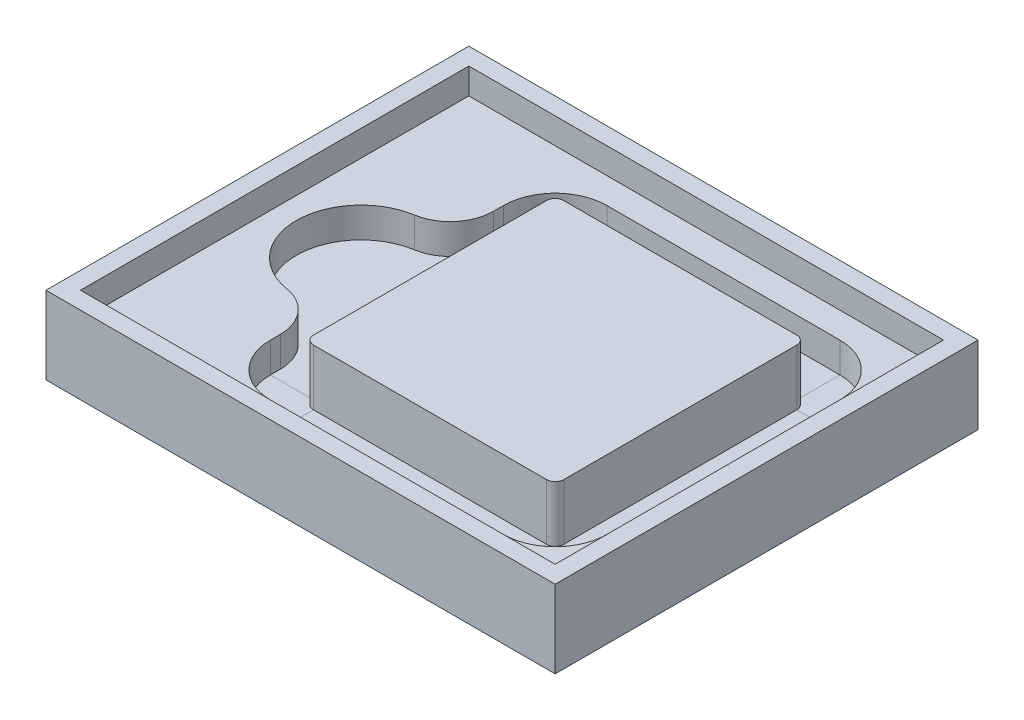
ISO-10303-21;
HEADER;
FILE_DESCRIPTION(('STEP AP214'),'2;1');
FILE_NAME('part.step','',(''),(''),'','','');
FILE_SCHEMA(('AUTOMOTIVE_DESIGN { 1 0 10303 214 1 1 1 1 }'));
ENDSEC;
DATA;
#1=APPLICATION_CONTEXT('core data for automotive mechanical design processes');
#2=APPLICATION_PROTOCOL_DEFINITION('international standard','automotive_design',2000,#1);
#3=PRODUCT_CONTEXT('',#1,'mechanical');
#4=PRODUCT('Part','Part','',(#3));
#5=PRODUCT_RELATED_PRODUCT_CATEGORY('part','',(#4));
#6=PRODUCT_DEFINITION_FORMATION('','',#4);
#7=PRODUCT_DEFINITION_CONTEXT('part definition',#1,'design');
#8=PRODUCT_DEFINITION('design','',#6,#7);
#9=PRODUCT_DEFINITION_SHAPE('','',#8);
#10=(LENGTH_UNIT() NAMED_UNIT(*) SI_UNIT(.MILLI.,.METRE.));
#11=(NAMED_UNIT(*) PLANE_ANGLE_UNIT() SI_UNIT($,.RADIAN.));
#12=(NAMED_UNIT(*) SI_UNIT($,.STERADIAN.) SOLID_ANGLE_UNIT());
#13=UNCERTAINTY_MEASURE_WITH_UNIT(LENGTH_MEASURE(1.E-05),#10,'distance_accuracy_value','');
#14=(GEOMETRIC_REPRESENTATION_CONTEXT(3) GLOBAL_UNCERTAINTY_ASSIGNED_CONTEXT((#13)) GLOBAL_UNIT_ASSIGNED_CONTEXT((#10,
#11,#12)) REPRESENTATION_CONTEXT('',''));
#15=CARTESIAN_POINT('',(0.,0.,0.));
#16=DIRECTION('',(0.,0.,1.));
#17=DIRECTION('',(1.,0.,0.));
#18=AXIS2_PLACEMENT_3D('',#15,#16,#17);
#19=CARTESIAN_POINT('',(0.,9.74999999999999,0.));
#20=DIRECTION('',(0.,-1.,0.));
#21=DIRECTION('',(0.,0.,-1.));
#22=AXIS2_PLACEMENT_3D('',#19,#20,#21);
#23=PLANE('',#22);
#24=DIRECTION('',(0.,0.,-1.));
#25=VECTOR('',#24,1.);
#26=CARTESIAN_POINT('',(6.07343481279655,9.75,-24.3269500399627));
#27=LINE('',#26,#25);
#28=CARTESIAN_POINT('',(6.07343481279655,9.74999999999998,20.6730499600373));
#29=VERTEX_POINT('',#28);
#30=CARTESIAN_POINT('',(6.07343481279655,9.75,-24.3269500399627));
#31=VERTEX_POINT('',#30);
#32=EDGE_CURVE('E524',#29,#31,#27,.T.);
#33=ORIENTED_EDGE('',*,*,#32,.T.);
#34=DIRECTION('',(-1.,0.,0.));
#35=VECTOR('',#34,1.);
#36=CARTESIAN_POINT('',(-48.9265651872034,9.75,-24.3269500399627));
#37=LINE('',#36,#35);
#38=CARTESIAN_POINT('',(-48.9265651872034,9.75,-24.3269500399627));
#39=VERTEX_POINT('',#38);
#40=EDGE_CURVE('E261',#31,#39,#37,.T.);
#41=ORIENTED_EDGE('',*,*,#40,.T.);
#42=DIRECTION('',(0.,0.,1.));
#43=VECTOR('',#42,1.);
#44=CARTESIAN_POINT('',(-48.9265651872034,9.75,-24.3269500399627));
#45=LINE('',#44,#43);
#46=CARTESIAN_POINT('',(-48.9265651872034,9.74999999999998,20.6730499600373));
#47=VERTEX_POINT('',#46);
#48=EDGE_CURVE('E520',#39,#47,#45,.T.);
#49=ORIENTED_EDGE('',*,*,#48,.T.);
#50=DIRECTION('',(1.,0.,0.));
#51=VECTOR('',#50,1.);
#52=CARTESIAN_POINT('',(-48.9265651872034,9.74999999999998,20.6730499600373));
#53=LINE('',#52,#51);
#54=EDGE_CURVE('E56',#47,#29,#53,.T.);
#55=ORIENTED_EDGE('',*,*,#54,.T.);
#56=EDGE_LOOP('',(#33,#41,#49,#55));
#57=FACE_BOUND('',#56,.T.);
#58=DIRECTION('',(-1.,0.,0.));
#59=VECTOR('',#58,1.);
#60=CARTESIAN_POINT('',(-2.92656518720339,9.75,17.6730499600373));
#61=LINE('',#60,#59);
#62=CARTESIAN_POINT('',(-2.92656518720339,9.75,17.6730499600373));
#63=VERTEX_POINT('',#62);
#64=CARTESIAN_POINT('',(-29.9265651872034,9.75,17.6730499600373));
#65=VERTEX_POINT('',#64);
#66=EDGE_CURVE('E407',#63,#65,#61,.T.);
#67=ORIENTED_EDGE('',*,*,#66,.T.);
#68=CARTESIAN_POINT('',(-29.9265651872034,9.75,11.6730499600373));
#69=DIRECTION('',(0.,-1.,0.));
#70=DIRECTION('',(0.,0.,-1.));
#71=AXIS2_PLACEMENT_3D('',#68,#69,#70);
#72=CIRCLE('',#71,5.99999999999998);
#73=CARTESIAN_POINT('',(-35.9265651872034,9.75,11.6730499600374));
#74=VERTEX_POINT('',#73);
#75=EDGE_CURVE('E425',#65,#74,#72,.T.);
#76=ORIENTED_EDGE('',*,*,#75,.T.);
#77=DIRECTION('',(0.,0.,-1.));
#78=VECTOR('',#77,1.);
#79=CARTESIAN_POINT('',(-35.9265651872034,9.75,11.6730499600374));
#80=LINE('',#79,#78);
#81=CARTESIAN_POINT('',(-35.9265651872034,9.75,10.5120126392904));
#82=VERTEX_POINT('',#81);
#83=EDGE_CURVE('E435',#74,#82,#80,.T.);
#84=ORIENTED_EDGE('',*,*,#83,.T.);
#85=CARTESIAN_POINT('',(-40.9265651872034,9.75,10.5120126392904));
#86=DIRECTION('',(0.,-1.,0.));
#87=DIRECTION('',(1.,0.,0.));
#88=AXIS2_PLACEMENT_3D('',#85,#86,#87);
#89=CIRCLE('',#88,5.);
#90=CARTESIAN_POINT('',(-40.1265651872034,9.74999999999999,5.57642756758922));
#91=VERTEX_POINT('',#90);
#92=EDGE_CURVE('E586',#91,#82,#89,.T.);
#93=ORIENTED_EDGE('',*,*,#92,.F.);
#94=CARTESIAN_POINT('',(-38.9265651872034,9.75,-1.82695003996262));
#95=DIRECTION('',(0.,1.,0.));
#96=DIRECTION('',(-1.,0.,0.));
#97=AXIS2_PLACEMENT_3D('',#94,#95,#96);
#98=CIRCLE('',#97,7.5);
#99=CARTESIAN_POINT('',(-40.1265651872034,9.75,-9.23032764751446));
#100=VERTEX_POINT('',#99);
#101=EDGE_CURVE('E64',#100,#91,#98,.T.);
#102=ORIENTED_EDGE('',*,*,#101,.F.);
#103=CARTESIAN_POINT('',(-40.9265651872034,9.75,-14.1659127192157));
#104=DIRECTION('',(0.,-1.,0.));
#105=DIRECTION('',(1.,0.,0.));
#106=AXIS2_PLACEMENT_3D('',#103,#104,#105);
#107=CIRCLE('',#106,5.);
#108=CARTESIAN_POINT('',(-35.9265651872034,9.75,-14.1659127192157));
#109=VERTEX_POINT('',#108);
#110=EDGE_CURVE('E582',#109,#100,#107,.T.);
#111=ORIENTED_EDGE('',*,*,#110,.F.);
#112=DIRECTION('',(0.,0.,1.));
#113=VECTOR('',#112,1.);
#114=CARTESIAN_POINT('',(-35.9265651872034,9.75,-15.3269500399627));
#115=LINE('',#114,#113);
#116=CARTESIAN_POINT('',(-35.9265651872034,9.75,-15.3269500399627));
#117=VERTEX_POINT('',#116);
#118=EDGE_CURVE('E306',#117,#109,#115,.T.);
#119=ORIENTED_EDGE('',*,*,#118,.F.);
#120=CARTESIAN_POINT('',(-29.9265651872034,9.75,-15.3269500399627));
#121=DIRECTION('',(0.,-1.,0.));
#122=DIRECTION('',(0.,0.,-1.));
#123=AXIS2_PLACEMENT_3D('',#120,#121,#122);
#124=CIRCLE('',#123,5.99999999999999);
#125=CARTESIAN_POINT('',(-29.9265651872034,9.75,-21.3269500399627));
#126=VERTEX_POINT('',#125);
#127=EDGE_CURVE('E317',#117,#126,#124,.T.);
#128=ORIENTED_EDGE('',*,*,#127,.T.);
#129=DIRECTION('',(1.,0.,0.));
#130=VECTOR('',#129,1.);
#131=CARTESIAN_POINT('',(-29.9265651872034,9.75,-21.3269500399627));
#132=LINE('',#131,#130);
#133=CARTESIAN_POINT('',(-2.92656518720343,9.75,-21.3269500399627));
#134=VERTEX_POINT('',#133);
#135=EDGE_CURVE('E335',#126,#134,#132,.T.);
#136=ORIENTED_EDGE('',*,*,#135,.T.);
#137=CARTESIAN_POINT('',(-2.92656518720344,9.75,-15.3269500399627));
#138=DIRECTION('',(0.,-1.,0.));
#139=DIRECTION('',(0.,0.,-1.));
#140=AXIS2_PLACEMENT_3D('',#137,#138,#139);
#141=CIRCLE('',#140,5.99999999999999);
#142=CARTESIAN_POINT('',(3.07343481279655,9.75,-15.3269500399627));
#143=VERTEX_POINT('',#142);
#144=EDGE_CURVE('E353',#134,#143,#141,.T.);
#145=ORIENTED_EDGE('',*,*,#144,.T.);
#146=DIRECTION('',(0.,0.,1.));
#147=VECTOR('',#146,1.);
#148=CARTESIAN_POINT('',(3.07343481279655,9.75,-15.3269500399627));
#149=LINE('',#148,#147);
#150=CARTESIAN_POINT('',(3.07343481279655,9.75,11.6730499600374));
#151=VERTEX_POINT('',#150);
#152=EDGE_CURVE('E371',#143,#151,#149,.T.);
#153=ORIENTED_EDGE('',*,*,#152,.T.);
#154=CARTESIAN_POINT('',(-2.92656518720344,9.75,11.6730499600373));
#155=DIRECTION('',(0.,-1.,0.));
#156=DIRECTION('',(0.,0.,-1.));
#157=AXIS2_PLACEMENT_3D('',#154,#155,#156);
#158=CIRCLE('',#157,5.99999999999998);
#159=EDGE_CURVE('E389',#151,#63,#158,.T.);
#160=ORIENTED_EDGE('',*,*,#159,.T.);
#161=EDGE_LOOP('',(#67,#76,#84,#93,#102,#111,#119,#128,#136,#145,#153,#160));
#162=FACE_BOUND('',#161,.T.);
#163=ADVANCED_FACE('F37',(#57,#162),#23,.F.);
#164=CARTESIAN_POINT('',(-30.9265651872034,9.75,11.6730499600373));
#165=DIRECTION('',(1.,0.,0.));
#166=DIRECTION('',(0.,0.,-1.));
#167=AXIS2_PLACEMENT_3D('',#164,#165,#166);
#168=PLANE('',#167);
#169=DIRECTION('',(0.,0.,-1.));
#170=VECTOR('',#169,1.);
#171=CARTESIAN_POINT('',(-30.9265651872034,6.25,11.6730499600373));
#172=LINE('',#171,#170);
#173=CARTESIAN_POINT('',(-30.9265651872034,6.25,11.6730499600373));
#174=VERTEX_POINT('',#173);
#175=CARTESIAN_POINT('',(-30.9265651872034,6.25,-1.82695003996267));
#176=VERTEX_POINT('',#175);
#177=EDGE_CURVE('E448',#174,#176,#172,.T.);
#178=ORIENTED_EDGE('',*,*,#177,.F.);
#179=DIRECTION('',(0.,-1.,0.));
#180=VECTOR('',#179,1.);
#181=CARTESIAN_POINT('',(-30.9265651872034,9.75,11.6730499600373));
#182=LINE('',#181,#180);
#183=CARTESIAN_POINT('',(-30.9265651872034,12.75,11.6730499600374));
#184=VERTEX_POINT('',#183);
#185=EDGE_CURVE('E422',#184,#174,#182,.T.);
#186=ORIENTED_EDGE('',*,*,#185,.F.);
#187=DIRECTION('',(0.,0.,1.));
#188=VECTOR('',#187,1.);
#189=CARTESIAN_POINT('',(-30.9265651872034,12.75,-15.3269500399627));
#190=LINE('',#189,#188);
#191=CARTESIAN_POINT('',(-30.9265651872034,12.75,-15.3269500399627));
#192=VERTEX_POINT('',#191);
#193=EDGE_CURVE('E272',#192,#184,#190,.T.);
#194=ORIENTED_EDGE('',*,*,#193,.F.);
#195=DIRECTION('',(0.,-1.,0.));
#196=VECTOR('',#195,1.);
#197=CARTESIAN_POINT('',(-30.9265651872034,9.75,-15.3269500399627));
#198=LINE('',#197,#196);
#199=CARTESIAN_POINT('',(-30.9265651872034,6.25,-15.3269500399627));
#200=VERTEX_POINT('',#199);
#201=EDGE_CURVE('E296',#192,#200,#198,.T.);
#202=ORIENTED_EDGE('',*,*,#201,.T.);
#203=DIRECTION('',(0.,0.,1.));
#204=VECTOR('',#203,1.);
#205=CARTESIAN_POINT('',(-30.9265651872034,6.25,-15.3269500399627));
#206=LINE('',#205,#204);
#207=EDGE_CURVE('E311',#200,#176,#206,.T.);
#208=ORIENTED_EDGE('',*,*,#207,.T.);
#209=EDGE_LOOP('',(#178,#186,#194,#202,#208));
#210=FACE_BOUND('',#209,.T.);
#211=ADVANCED_FACE('F450',(#210),#168,.F.);
#212=CARTESIAN_POINT('',(-35.9265651872034,9.75,11.6730499600374));
#213=DIRECTION('',(-1.,0.,0.));
#214=DIRECTION('',(0.,0.,1.));
#215=AXIS2_PLACEMENT_3D('',#212,#213,#214);
#216=PLANE('',#215);
#217=ORIENTED_EDGE('',*,*,#83,.F.);
#218=DIRECTION('',(0.,1.,0.));
#219=VECTOR('',#218,1.);
#220=CARTESIAN_POINT('',(-35.9265651872034,9.75,11.6730499600374));
#221=LINE('',#220,#219);
#222=CARTESIAN_POINT('',(-35.9265651872034,6.25,11.6730499600374));
#223=VERTEX_POINT('',#222);
#224=EDGE_CURVE('E416',#223,#74,#221,.T.);
#225=ORIENTED_EDGE('',*,*,#224,.F.);
#226=DIRECTION('',(0.,0.,-1.));
#227=VECTOR('',#226,1.);
#228=CARTESIAN_POINT('',(-35.9265651872034,6.25,11.6730499600374));
#229=LINE('',#228,#227);
#230=CARTESIAN_POINT('',(-35.9265651872034,6.25,10.5120126392904));
#231=VERTEX_POINT('',#230);
#232=EDGE_CURVE('E438',#223,#231,#229,.T.);
#233=ORIENTED_EDGE('',*,*,#232,.T.);
#234=DIRECTION('',(0.,-1.,0.));
#235=VECTOR('',#234,1.);
#236=CARTESIAN_POINT('',(-35.9265651872034,6.25,10.5120126392904));
#237=LINE('',#236,#235);
#238=EDGE_CURVE('E580',#82,#231,#237,.T.);
#239=ORIENTED_EDGE('',*,*,#238,.F.);
#240=EDGE_LOOP('',(#217,#225,#233,#239));
#241=FACE_BOUND('',#240,.T.);
#242=ADVANCED_FACE('F460',(#241),#216,.F.);
#243=CARTESIAN_POINT('',(-29.9265651872034,6.25,11.6730499600373));
#244=DIRECTION('',(0.,-1.,0.));
#245=DIRECTION('',(0.,0.,-1.));
#246=AXIS2_PLACEMENT_3D('',#243,#244,#245);
#247=CYLINDRICAL_SURFACE('',#246,0.999999999999985);
#248=DIRECTION('',(0.,-1.,0.));
#249=VECTOR('',#248,1.);
#250=CARTESIAN_POINT('',(-29.9265651872034,9.75,12.6730499600373));
#251=LINE('',#250,#249);
#252=CARTESIAN_POINT('',(-29.9265651872034,12.75,12.6730499600373));
#253=VERTEX_POINT('',#252);
#254=CARTESIAN_POINT('',(-29.9265651872034,6.25,12.6730499600373));
#255=VERTEX_POINT('',#254);
#256=EDGE_CURVE('E404',#253,#255,#251,.T.);
#257=ORIENTED_EDGE('',*,*,#256,.F.);
#258=CARTESIAN_POINT('',(-29.9265651872034,12.75,11.6730499600373));
#259=DIRECTION('',(0.,1.,0.));
#260=DIRECTION('',(0.,0.,1.));
#261=AXIS2_PLACEMENT_3D('',#258,#259,#260);
#262=CIRCLE('',#261,0.999999999999984);
#263=EDGE_CURVE('E275',#184,#253,#262,.T.);
#264=ORIENTED_EDGE('',*,*,#263,.F.);
#265=ORIENTED_EDGE('',*,*,#185,.T.);
#266=CARTESIAN_POINT('',(-29.9265651872034,6.25,11.6730499600373));
#267=DIRECTION('',(0.,-1.,0.));
#268=DIRECTION('',(0.,0.,-1.));
#269=AXIS2_PLACEMENT_3D('',#266,#267,#268);
#270=CIRCLE('',#269,0.999999999999985);
#271=EDGE_CURVE('E431',#255,#174,#270,.T.);
#272=ORIENTED_EDGE('',*,*,#271,.F.);
#273=EDGE_LOOP('',(#257,#264,#265,#272));
#274=FACE_BOUND('',#273,.T.);
#275=ADVANCED_FACE('F675',(#274),#247,.T.);
#276=CARTESIAN_POINT('',(-29.9265651872034,6.25,12.6730499600373));
#277=DIRECTION('',(0.,-1.,0.));
#278=DIRECTION('',(0.,0.,-1.));
#279=AXIS2_PLACEMENT_3D('',#276,#277,#278);
#280=PLANE('',#279);
#281=DIRECTION('',(0.,0.,1.));
#282=VECTOR('',#281,1.);
#283=CARTESIAN_POINT('',(-29.9265651872034,6.25,12.6730499600373));
#284=LINE('',#283,#282);
#285=CARTESIAN_POINT('',(-29.9265651872034,6.25,17.6730499600373));
#286=VERTEX_POINT('',#285);
#287=EDGE_CURVE('E401',#255,#286,#284,.T.);
#288=ORIENTED_EDGE('',*,*,#287,.F.);
#289=ORIENTED_EDGE('',*,*,#271,.T.);
#290=DIRECTION('',(-1.,0.,0.));
#291=VECTOR('',#290,1.);
#292=CARTESIAN_POINT('',(-30.9265651872034,6.25,11.6730499600373));
#293=LINE('',#292,#291);
#294=EDGE_CURVE('E419',#174,#223,#293,.T.);
#295=ORIENTED_EDGE('',*,*,#294,.T.);
#296=CARTESIAN_POINT('',(-29.9265651872034,6.25,11.6730499600373));
#297=DIRECTION('',(0.,-1.,0.));
#298=DIRECTION('',(0.,0.,-1.));
#299=AXIS2_PLACEMENT_3D('',#296,#297,#298);
#300=CIRCLE('',#299,5.99999999999998);
#301=EDGE_CURVE('E428',#286,#223,#300,.T.);
#302=ORIENTED_EDGE('',*,*,#301,.F.);
#303=EDGE_LOOP('',(#288,#289,#295,#302));
#304=FACE_BOUND('',#303,.T.);
#305=ADVANCED_FACE('F679',(#304),#280,.F.);
#306=CARTESIAN_POINT('',(-29.9265651872034,6.25,11.6730499600373));
#307=DIRECTION('',(0.,-1.,0.));
#308=DIRECTION('',(0.,0.,-1.));
#309=AXIS2_PLACEMENT_3D('',#306,#307,#308);
#310=CYLINDRICAL_SURFACE('',#309,5.99999999999998);
#311=DIRECTION('',(0.,1.,0.));
#312=VECTOR('',#311,1.);
#313=CARTESIAN_POINT('',(-29.9265651872034,9.75,17.6730499600373));
#314=LINE('',#313,#312);
#315=EDGE_CURVE('E398',#286,#65,#314,.T.);
#316=ORIENTED_EDGE('',*,*,#315,.F.);
#317=ORIENTED_EDGE('',*,*,#301,.T.);
#318=ORIENTED_EDGE('',*,*,#224,.T.);
#319=ORIENTED_EDGE('',*,*,#75,.F.);
#320=EDGE_LOOP('',(#316,#317,#318,#319));
#321=FACE_BOUND('',#320,.T.);
#322=ADVANCED_FACE('F634',(#321),#310,.F.);
#323=CARTESIAN_POINT('',(-2.92656518720342,9.75,12.6730499600373));
#324=DIRECTION('',(0.,0.,-1.));
#325=DIRECTION('',(-1.,0.,0.));
#326=AXIS2_PLACEMENT_3D('',#323,#324,#325);
#327=PLANE('',#326);
#328=DIRECTION('',(0.,-1.,0.));
#329=VECTOR('',#328,1.);
#330=CARTESIAN_POINT('',(-2.92656518720342,9.75,12.6730499600373));
#331=LINE('',#330,#329);
#332=CARTESIAN_POINT('',(-2.92656518720342,12.75,12.6730499600373));
#333=VERTEX_POINT('',#332);
#334=CARTESIAN_POINT('',(-2.92656518720342,6.25,12.6730499600373));
#335=VERTEX_POINT('',#334);
#336=EDGE_CURVE('E386',#333,#335,#331,.T.);
#337=ORIENTED_EDGE('',*,*,#336,.F.);
#338=DIRECTION('',(1.,0.,0.));
#339=VECTOR('',#338,1.);
#340=CARTESIAN_POINT('',(-29.9265651872034,12.75,12.6730499600373));
#341=LINE('',#340,#339);
#342=EDGE_CURVE('E278',#253,#333,#341,.T.);
#343=ORIENTED_EDGE('',*,*,#342,.F.);
#344=ORIENTED_EDGE('',*,*,#256,.T.);
#345=DIRECTION('',(-1.,0.,0.));
#346=VECTOR('',#345,1.);
#347=CARTESIAN_POINT('',(-2.92656518720342,6.25,12.6730499600373));
#348=LINE('',#347,#346);
#349=EDGE_CURVE('E413',#335,#255,#348,.T.);
#350=ORIENTED_EDGE('',*,*,#349,.F.);
#351=EDGE_LOOP('',(#337,#343,#344,#350));
#352=FACE_BOUND('',#351,.T.);
#353=ADVANCED_FACE('F677',(#352),#327,.F.);
#354=CARTESIAN_POINT('',(-2.92656518720342,6.25,12.6730499600373));
#355=DIRECTION('',(0.,-1.,0.));
#356=DIRECTION('',(0.,0.,-1.));
#357=AXIS2_PLACEMENT_3D('',#354,#355,#356);
#358=PLANE('',#357);
#359=DIRECTION('',(0.,0.,1.));
#360=VECTOR('',#359,1.);
#361=CARTESIAN_POINT('',(-2.92656518720342,6.25,12.6730499600373));
#362=LINE('',#361,#360);
#363=CARTESIAN_POINT('',(-2.92656518720339,6.25,17.6730499600373));
#364=VERTEX_POINT('',#363);
#365=EDGE_CURVE('E383',#335,#364,#362,.T.);
#366=ORIENTED_EDGE('',*,*,#365,.F.);
#367=ORIENTED_EDGE('',*,*,#349,.T.);
#368=ORIENTED_EDGE('',*,*,#287,.T.);
#369=DIRECTION('',(-1.,0.,0.));
#370=VECTOR('',#369,1.);
#371=CARTESIAN_POINT('',(-2.92656518720339,6.25,17.6730499600373));
#372=LINE('',#371,#370);
#373=EDGE_CURVE('E410',#364,#286,#372,.T.);
#374=ORIENTED_EDGE('',*,*,#373,.F.);
#375=EDGE_LOOP('',(#366,#367,#368,#374));
#376=FACE_BOUND('',#375,.T.);
#377=ADVANCED_FACE('F640',(#376),#358,.F.);
#378=CARTESIAN_POINT('',(-2.92656518720339,9.75,17.6730499600373));
#379=DIRECTION('',(0.,0.,1.));
#380=DIRECTION('',(1.,0.,0.));
#381=AXIS2_PLACEMENT_3D('',#378,#379,#380);
#382=PLANE('',#381);
#383=DIRECTION('',(0.,1.,0.));
#384=VECTOR('',#383,1.);
#385=CARTESIAN_POINT('',(-2.92656518720339,9.75,17.6730499600373));
#386=LINE('',#385,#384);
#387=EDGE_CURVE('E380',#364,#63,#386,.T.);
#388=ORIENTED_EDGE('',*,*,#387,.F.);
#389=ORIENTED_EDGE('',*,*,#373,.T.);
#390=ORIENTED_EDGE('',*,*,#315,.T.);
#391=ORIENTED_EDGE('',*,*,#66,.F.);
#392=EDGE_LOOP('',(#388,#389,#390,#391));
#393=FACE_BOUND('',#392,.T.);
#394=ADVANCED_FACE('F637',(#393),#382,.F.);
#395=CARTESIAN_POINT('',(-2.92656518720344,6.25,11.6730499600373));
#396=DIRECTION('',(0.,-1.,0.));
#397=DIRECTION('',(0.,0.,-1.));
#398=AXIS2_PLACEMENT_3D('',#395,#396,#397);
#399=CYLINDRICAL_SURFACE('',#398,0.999999999999987);
#400=DIRECTION('',(0.,-1.,0.));
#401=VECTOR('',#400,1.);
#402=CARTESIAN_POINT('',(-1.92656518720345,9.75,11.6730499600373));
#403=LINE('',#402,#401);
#404=CARTESIAN_POINT('',(-1.92656518720345,12.75,11.6730499600373));
#405=VERTEX_POINT('',#404);
#406=CARTESIAN_POINT('',(-1.92656518720345,6.25,11.6730499600373));
#407=VERTEX_POINT('',#406);
#408=EDGE_CURVE('E368',#405,#407,#403,.T.);
#409=ORIENTED_EDGE('',*,*,#408,.F.);
#410=CARTESIAN_POINT('',(-2.92656518720344,12.75,11.6730499600373));
#411=DIRECTION('',(0.,1.,0.));
#412=DIRECTION('',(0.,0.,1.));
#413=AXIS2_PLACEMENT_3D('',#410,#411,#412);
#414=CIRCLE('',#413,0.999999999999987);
#415=EDGE_CURVE('E281',#333,#405,#414,.T.);
#416=ORIENTED_EDGE('',*,*,#415,.F.);
#417=ORIENTED_EDGE('',*,*,#336,.T.);
#418=CARTESIAN_POINT('',(-2.92656518720344,6.25,11.6730499600373));
#419=DIRECTION('',(0.,-1.,0.));
#420=DIRECTION('',(0.,0.,-1.));
#421=AXIS2_PLACEMENT_3D('',#418,#419,#420);
#422=CIRCLE('',#421,0.999999999999987);
#423=EDGE_CURVE('E395',#407,#335,#422,.T.);
#424=ORIENTED_EDGE('',*,*,#423,.F.);
#425=EDGE_LOOP('',(#409,#416,#417,#424));
#426=FACE_BOUND('',#425,.T.);
#427=ADVANCED_FACE('F646',(#426),#399,.T.);
#428=CARTESIAN_POINT('',(-1.92656518720345,6.25,11.6730499600373));
#429=DIRECTION('',(0.,-1.,0.));
#430=DIRECTION('',(0.,0.,-1.));
#431=AXIS2_PLACEMENT_3D('',#428,#429,#430);
#432=PLANE('',#431);
#433=DIRECTION('',(1.,0.,0.));
#434=VECTOR('',#433,1.);
#435=CARTESIAN_POINT('',(-1.92656518720345,6.25,11.6730499600373));
#436=LINE('',#435,#434);
#437=CARTESIAN_POINT('',(3.07343481279655,6.25,11.6730499600374));
#438=VERTEX_POINT('',#437);
#439=EDGE_CURVE('E365',#407,#438,#436,.T.);
#440=ORIENTED_EDGE('',*,*,#439,.F.);
#441=ORIENTED_EDGE('',*,*,#423,.T.);
#442=ORIENTED_EDGE('',*,*,#365,.T.);
#443=CARTESIAN_POINT('',(-2.92656518720344,6.25,11.6730499600373));
#444=DIRECTION('',(0.,-1.,0.));
#445=DIRECTION('',(0.,0.,-1.));
#446=AXIS2_PLACEMENT_3D('',#443,#444,#445);
#447=CIRCLE('',#446,5.99999999999998);
#448=EDGE_CURVE('E392',#438,#364,#447,.T.);
#449=ORIENTED_EDGE('',*,*,#448,.F.);
#450=EDGE_LOOP('',(#440,#441,#442,#449));
#451=FACE_BOUND('',#450,.T.);
#452=ADVANCED_FACE('F644',(#451),#432,.F.);
#453=CARTESIAN_POINT('',(-2.92656518720344,6.25,11.6730499600373));
#454=DIRECTION('',(0.,-1.,0.));
#455=DIRECTION('',(0.,0.,-1.));
#456=AXIS2_PLACEMENT_3D('',#453,#454,#455);
#457=CYLINDRICAL_SURFACE('',#456,5.99999999999998);
#458=DIRECTION('',(0.,1.,0.));
#459=VECTOR('',#458,1.);
#460=CARTESIAN_POINT('',(3.07343481279655,9.75,11.6730499600374));
#461=LINE('',#460,#459);
#462=EDGE_CURVE('E362',#438,#151,#461,.T.);
#463=ORIENTED_EDGE('',*,*,#462,.F.);
#464=ORIENTED_EDGE('',*,*,#448,.T.);
#465=ORIENTED_EDGE('',*,*,#387,.T.);
#466=ORIENTED_EDGE('',*,*,#159,.F.);
#467=EDGE_LOOP('',(#463,#464,#465,#466));
#468=FACE_BOUND('',#467,.T.);
#469=ADVANCED_FACE('F698',(#468),#457,.F.);
#470=CARTESIAN_POINT('',(-1.92656518720345,9.75,-15.3269500399627));
#471=DIRECTION('',(-1.,0.,0.));
#472=DIRECTION('',(0.,0.,1.));
#473=AXIS2_PLACEMENT_3D('',#470,#471,#472);
#474=PLANE('',#473);
#475=DIRECTION('',(0.,-1.,0.));
#476=VECTOR('',#475,1.);
#477=CARTESIAN_POINT('',(-1.92656518720345,9.75,-15.3269500399627));
#478=LINE('',#477,#476);
#479=CARTESIAN_POINT('',(-1.92656518720345,12.75,-15.3269500399627));
#480=VERTEX_POINT('',#479);
#481=CARTESIAN_POINT('',(-1.92656518720345,6.25,-15.3269500399627));
#482=VERTEX_POINT('',#481);
#483=EDGE_CURVE('E350',#480,#482,#478,.T.);
#484=ORIENTED_EDGE('',*,*,#483,.F.);
#485=DIRECTION('',(0.,0.,-1.));
#486=VECTOR('',#485,1.);
#487=CARTESIAN_POINT('',(-1.92656518720345,12.75,11.6730499600373));
#488=LINE('',#487,#486);
#489=EDGE_CURVE('E284',#405,#480,#488,.T.);
#490=ORIENTED_EDGE('',*,*,#489,.F.);
#491=ORIENTED_EDGE('',*,*,#408,.T.);
#492=DIRECTION('',(0.,0.,1.));
#493=VECTOR('',#492,1.);
#494=CARTESIAN_POINT('',(-1.92656518720345,6.25,-15.3269500399627));
#495=LINE('',#494,#493);
#496=EDGE_CURVE('E377',#482,#407,#495,.T.);
#497=ORIENTED_EDGE('',*,*,#496,.F.);
#498=EDGE_LOOP('',(#484,#490,#491,#497));
#499=FACE_BOUND('',#498,.T.);
#500=ADVANCED_FACE('F650',(#499),#474,.F.);
#501=CARTESIAN_POINT('',(-1.92656518720345,6.25,-15.3269500399627));
#502=DIRECTION('',(0.,-1.,0.));
#503=DIRECTION('',(1.,0.,0.));
#504=AXIS2_PLACEMENT_3D('',#501,#502,#503);
#505=PLANE('',#504);
#506=DIRECTION('',(1.,0.,0.));
#507=VECTOR('',#506,1.);
#508=CARTESIAN_POINT('',(-1.92656518720345,6.25,-15.3269500399627));
#509=LINE('',#508,#507);
#510=CARTESIAN_POINT('',(3.07343481279655,6.25,-15.3269500399627));
#511=VERTEX_POINT('',#510);
#512=EDGE_CURVE('E347',#482,#511,#509,.T.);
#513=ORIENTED_EDGE('',*,*,#512,.F.);
#514=ORIENTED_EDGE('',*,*,#496,.T.);
#515=ORIENTED_EDGE('',*,*,#439,.T.);
#516=DIRECTION('',(0.,0.,1.));
#517=VECTOR('',#516,1.);
#518=CARTESIAN_POINT('',(3.07343481279655,6.25,-15.3269500399627));
#519=LINE('',#518,#517);
#520=EDGE_CURVE('E374',#511,#438,#519,.T.);
#521=ORIENTED_EDGE('',*,*,#520,.F.);
#522=EDGE_LOOP('',(#513,#514,#515,#521));
#523=FACE_BOUND('',#522,.T.);
#524=ADVANCED_FACE('F704',(#523),#505,.F.);
#525=CARTESIAN_POINT('',(3.07343481279655,9.75,-15.3269500399627));
#526=DIRECTION('',(1.,0.,0.));
#527=DIRECTION('',(0.,0.,-1.));
#528=AXIS2_PLACEMENT_3D('',#525,#526,#527);
#529=PLANE('',#528);
#530=DIRECTION('',(0.,1.,0.));
#531=VECTOR('',#530,1.);
#532=CARTESIAN_POINT('',(3.07343481279655,9.75,-15.3269500399627));
#533=LINE('',#532,#531);
#534=EDGE_CURVE('E344',#511,#143,#533,.T.);
#535=ORIENTED_EDGE('',*,*,#534,.F.);
#536=ORIENTED_EDGE('',*,*,#520,.T.);
#537=ORIENTED_EDGE('',*,*,#462,.T.);
#538=ORIENTED_EDGE('',*,*,#152,.F.);
#539=EDGE_LOOP('',(#535,#536,#537,#538));
#540=FACE_BOUND('',#539,.T.);
#541=ADVANCED_FACE('F707',(#540),#529,.F.);
#542=CARTESIAN_POINT('',(-2.92656518720344,6.25,-15.3269500399627));
#543=DIRECTION('',(0.,-1.,0.));
#544=DIRECTION('',(0.,0.,-1.));
#545=AXIS2_PLACEMENT_3D('',#542,#543,#544);
#546=CYLINDRICAL_SURFACE('',#545,0.99999999999999);
#547=DIRECTION('',(0.,-1.,0.));
#548=VECTOR('',#547,1.);
#549=CARTESIAN_POINT('',(-2.92656518720345,9.75,-16.3269500399627));
#550=LINE('',#549,#548);
#551=CARTESIAN_POINT('',(-2.92656518720345,12.75,-16.3269500399627));
#552=VERTEX_POINT('',#551);
#553=CARTESIAN_POINT('',(-2.92656518720345,6.25,-16.3269500399627));
#554=VERTEX_POINT('',#553);
#555=EDGE_CURVE('E332',#552,#554,#550,.T.);
#556=ORIENTED_EDGE('',*,*,#555,.F.);
#557=CARTESIAN_POINT('',(-2.92656518720344,12.75,-15.3269500399627));
#558=DIRECTION('',(0.,1.,0.));
#559=DIRECTION('',(0.,0.,1.));
#560=AXIS2_PLACEMENT_3D('',#557,#558,#559);
#561=CIRCLE('',#560,0.99999999999999);
#562=EDGE_CURVE('E287',#480,#552,#561,.T.);
#563=ORIENTED_EDGE('',*,*,#562,.F.);
#564=ORIENTED_EDGE('',*,*,#483,.T.);
#565=CARTESIAN_POINT('',(-2.92656518720344,6.25,-15.3269500399627));
#566=DIRECTION('',(0.,-1.,0.));
#567=DIRECTION('',(0.,0.,-1.));
#568=AXIS2_PLACEMENT_3D('',#565,#566,#567);
#569=CIRCLE('',#568,0.99999999999999);
#570=EDGE_CURVE('E359',#554,#482,#569,.T.);
#571=ORIENTED_EDGE('',*,*,#570,.F.);
#572=EDGE_LOOP('',(#556,#563,#564,#571));
#573=FACE_BOUND('',#572,.T.);
#574=ADVANCED_FACE('F654',(#573),#546,.T.);
#575=CARTESIAN_POINT('',(-2.92656518720345,6.25,-16.3269500399627));
#576=DIRECTION('',(0.,-1.,0.));
#577=DIRECTION('',(0.,0.,-1.));
#578=AXIS2_PLACEMENT_3D('',#575,#576,#577);
#579=PLANE('',#578);
#580=DIRECTION('',(0.,0.,-1.));
#581=VECTOR('',#580,1.);
#582=CARTESIAN_POINT('',(-2.92656518720345,6.25,-16.3269500399627));
#583=LINE('',#582,#581);
#584=CARTESIAN_POINT('',(-2.92656518720343,6.25,-21.3269500399627));
#585=VERTEX_POINT('',#584);
#586=EDGE_CURVE('E329',#554,#585,#583,.T.);
#587=ORIENTED_EDGE('',*,*,#586,.F.);
#588=ORIENTED_EDGE('',*,*,#570,.T.);
#589=ORIENTED_EDGE('',*,*,#512,.T.);
#590=CARTESIAN_POINT('',(-2.92656518720344,6.25,-15.3269500399627));
#591=DIRECTION('',(0.,-1.,0.));
#592=DIRECTION('',(0.,0.,-1.));
#593=AXIS2_PLACEMENT_3D('',#590,#591,#592);
#594=CIRCLE('',#593,5.99999999999999);
#595=EDGE_CURVE('E356',#585,#511,#594,.T.);
#596=ORIENTED_EDGE('',*,*,#595,.F.);
#597=EDGE_LOOP('',(#587,#588,#589,#596));
#598=FACE_BOUND('',#597,.T.);
#599=ADVANCED_FACE('F660',(#598),#579,.F.);
#600=CARTESIAN_POINT('',(-2.92656518720344,6.25,-15.3269500399627));
#601=DIRECTION('',(0.,-1.,0.));
#602=DIRECTION('',(0.,0.,-1.));
#603=AXIS2_PLACEMENT_3D('',#600,#601,#602);
#604=CYLINDRICAL_SURFACE('',#603,5.99999999999999);
#605=DIRECTION('',(0.,1.,0.));
#606=VECTOR('',#605,1.);
#607=CARTESIAN_POINT('',(-2.92656518720343,9.75,-21.3269500399627));
#608=LINE('',#607,#606);
#609=EDGE_CURVE('E326',#585,#134,#608,.T.);
#610=ORIENTED_EDGE('',*,*,#609,.F.);
#611=ORIENTED_EDGE('',*,*,#595,.T.);
#612=ORIENTED_EDGE('',*,*,#534,.T.);
#613=ORIENTED_EDGE('',*,*,#144,.F.);
#614=EDGE_LOOP('',(#610,#611,#612,#613));
#615=FACE_BOUND('',#614,.T.);
#616=ADVANCED_FACE('F716',(#615),#604,.F.);
#617=CARTESIAN_POINT('',(-29.9265651872035,9.75,-16.3269500399627));
#618=DIRECTION('',(0.,0.,1.));
#619=DIRECTION('',(1.,0.,0.));
#620=AXIS2_PLACEMENT_3D('',#617,#618,#619);
#621=PLANE('',#620);
#622=DIRECTION('',(0.,-1.,0.));
#623=VECTOR('',#622,1.);
#624=CARTESIAN_POINT('',(-29.9265651872035,9.75,-16.3269500399627));
#625=LINE('',#624,#623);
#626=CARTESIAN_POINT('',(-29.9265651872035,12.75,-16.3269500399627));
#627=VERTEX_POINT('',#626);
#628=CARTESIAN_POINT('',(-29.9265651872035,6.25,-16.3269500399627));
#629=VERTEX_POINT('',#628);
#630=EDGE_CURVE('E314',#627,#629,#625,.T.);
#631=ORIENTED_EDGE('',*,*,#630,.F.);
#632=DIRECTION('',(-1.,0.,0.));
#633=VECTOR('',#632,1.);
#634=CARTESIAN_POINT('',(-2.92656518720345,12.75,-16.3269500399627));
#635=LINE('',#634,#633);
#636=EDGE_CURVE('E290',#552,#627,#635,.T.);
#637=ORIENTED_EDGE('',*,*,#636,.F.);
#638=ORIENTED_EDGE('',*,*,#555,.T.);
#639=DIRECTION('',(1.,0.,0.));
#640=VECTOR('',#639,1.);
#641=CARTESIAN_POINT('',(-29.9265651872035,6.25,-16.3269500399627));
#642=LINE('',#641,#640);
#643=EDGE_CURVE('E341',#629,#554,#642,.T.);
#644=ORIENTED_EDGE('',*,*,#643,.F.);
#645=EDGE_LOOP('',(#631,#637,#638,#644));
#646=FACE_BOUND('',#645,.T.);
#647=ADVANCED_FACE('F658',(#646),#621,.F.);
#648=CARTESIAN_POINT('',(-29.9265651872035,6.25,-16.3269500399627));
#649=DIRECTION('',(0.,-1.,0.));
#650=DIRECTION('',(0.,0.,-1.));
#651=AXIS2_PLACEMENT_3D('',#648,#649,#650);
#652=PLANE('',#651);
#653=DIRECTION('',(0.,0.,-1.));
#654=VECTOR('',#653,1.);
#655=CARTESIAN_POINT('',(-29.9265651872035,6.25,-16.3269500399627));
#656=LINE('',#655,#654);
#657=CARTESIAN_POINT('',(-29.9265651872034,6.25,-21.3269500399627));
#658=VERTEX_POINT('',#657);
#659=EDGE_CURVE('E310',#629,#658,#656,.T.);
#660=ORIENTED_EDGE('',*,*,#659,.F.);
#661=ORIENTED_EDGE('',*,*,#643,.T.);
#662=ORIENTED_EDGE('',*,*,#586,.T.);
#663=DIRECTION('',(1.,0.,0.));
#664=VECTOR('',#663,1.);
#665=CARTESIAN_POINT('',(-29.9265651872034,6.25,-21.3269500399627));
#666=LINE('',#665,#664);
#667=EDGE_CURVE('E338',#658,#585,#666,.T.);
#668=ORIENTED_EDGE('',*,*,#667,.F.);
#669=EDGE_LOOP('',(#660,#661,#662,#668));
#670=FACE_BOUND('',#669,.T.);
#671=ADVANCED_FACE('F664',(#670),#652,.F.);
#672=CARTESIAN_POINT('',(-29.9265651872034,9.75,-21.3269500399627));
#673=DIRECTION('',(0.,0.,-1.));
#674=DIRECTION('',(-1.,0.,0.));
#675=AXIS2_PLACEMENT_3D('',#672,#673,#674);
#676=PLANE('',#675);
#677=DIRECTION('',(0.,1.,0.));
#678=VECTOR('',#677,1.);
#679=CARTESIAN_POINT('',(-29.9265651872034,9.75,-21.3269500399627));
#680=LINE('',#679,#678);
#681=EDGE_CURVE('E307',#658,#126,#680,.T.);
#682=ORIENTED_EDGE('',*,*,#681,.F.);
#683=ORIENTED_EDGE('',*,*,#667,.T.);
#684=ORIENTED_EDGE('',*,*,#609,.T.);
#685=ORIENTED_EDGE('',*,*,#135,.F.);
#686=EDGE_LOOP('',(#682,#683,#684,#685));
#687=FACE_BOUND('',#686,.T.);
#688=ADVANCED_FACE('F724',(#687),#676,.F.);
#689=CARTESIAN_POINT('',(-29.9265651872034,6.25,-15.3269500399627));
#690=DIRECTION('',(0.,-1.,0.));
#691=DIRECTION('',(0.,0.,-1.));
#692=AXIS2_PLACEMENT_3D('',#689,#690,#691);
#693=CYLINDRICAL_SURFACE('',#692,0.99999999999999);
#694=ORIENTED_EDGE('',*,*,#201,.F.);
#695=CARTESIAN_POINT('',(-29.9265651872034,12.75,-15.3269500399627));
#696=DIRECTION('',(0.,1.,0.));
#697=DIRECTION('',(0.,0.,1.));
#698=AXIS2_PLACEMENT_3D('',#695,#696,#697);
#699=CIRCLE('',#698,0.99999999999999);
#700=EDGE_CURVE('E247',#627,#192,#699,.T.);
#701=ORIENTED_EDGE('',*,*,#700,.F.);
#702=ORIENTED_EDGE('',*,*,#630,.T.);
#703=CARTESIAN_POINT('',(-29.9265651872034,6.25,-15.3269500399627));
#704=DIRECTION('',(0.,-1.,0.));
#705=DIRECTION('',(0.,0.,-1.));
#706=AXIS2_PLACEMENT_3D('',#703,#704,#705);
#707=CIRCLE('',#706,0.99999999999999);
#708=EDGE_CURVE('E323',#200,#629,#707,.T.);
#709=ORIENTED_EDGE('',*,*,#708,.F.);
#710=EDGE_LOOP('',(#694,#701,#702,#709));
#711=FACE_BOUND('',#710,.T.);
#712=ADVANCED_FACE('F669',(#711),#693,.T.);
#713=CARTESIAN_POINT('',(-30.9265651872034,6.25,-15.3269500399627));
#714=DIRECTION('',(0.,-1.,0.));
#715=DIRECTION('',(0.,0.,-1.));
#716=AXIS2_PLACEMENT_3D('',#713,#714,#715);
#717=PLANE('',#716);
#718=DIRECTION('',(-1.,0.,0.));
#719=VECTOR('',#718,1.);
#720=CARTESIAN_POINT('',(-30.9265651872034,6.25,-15.3269500399627));
#721=LINE('',#720,#719);
#722=CARTESIAN_POINT('',(-35.9265651872034,6.25,-15.3269500399627));
#723=VERTEX_POINT('',#722);
#724=EDGE_CURVE('E300',#200,#723,#721,.T.);
#725=ORIENTED_EDGE('',*,*,#724,.F.);
#726=ORIENTED_EDGE('',*,*,#708,.T.);
#727=ORIENTED_EDGE('',*,*,#659,.T.);
#728=CARTESIAN_POINT('',(-29.9265651872034,6.25,-15.3269500399627));
#729=DIRECTION('',(0.,-1.,0.));
#730=DIRECTION('',(0.,0.,-1.));
#731=AXIS2_PLACEMENT_3D('',#728,#729,#730);
#732=CIRCLE('',#731,5.99999999999999);
#733=EDGE_CURVE('E320',#723,#658,#732,.T.);
#734=ORIENTED_EDGE('',*,*,#733,.F.);
#735=EDGE_LOOP('',(#725,#726,#727,#734));
#736=FACE_BOUND('',#735,.T.);
#737=ADVANCED_FACE('F667',(#736),#717,.F.);
#738=CARTESIAN_POINT('',(-29.9265651872034,6.25,-15.3269500399627));
#739=DIRECTION('',(0.,-1.,0.));
#740=DIRECTION('',(0.,0.,-1.));
#741=AXIS2_PLACEMENT_3D('',#738,#739,#740);
#742=CYLINDRICAL_SURFACE('',#741,5.99999999999999);
#743=DIRECTION('',(0.,1.,0.));
#744=VECTOR('',#743,1.);
#745=CARTESIAN_POINT('',(-35.9265651872034,9.75,-15.3269500399627));
#746=LINE('',#745,#744);
#747=EDGE_CURVE('E303',#723,#117,#746,.T.);
#748=ORIENTED_EDGE('',*,*,#747,.F.);
#749=ORIENTED_EDGE('',*,*,#733,.T.);
#750=ORIENTED_EDGE('',*,*,#681,.T.);
#751=ORIENTED_EDGE('',*,*,#127,.F.);
#752=EDGE_LOOP('',(#748,#749,#750,#751));
#753=FACE_BOUND('',#752,.T.);
#754=ADVANCED_FACE('F554',(#753),#742,.F.);
#755=CARTESIAN_POINT('',(-30.9265651872034,6.25,-15.3269500399627));
#756=DIRECTION('',(0.,1.,0.));
#757=DIRECTION('',(-1.,0.,0.));
#758=AXIS2_PLACEMENT_3D('',#755,#756,#757);
#759=PLANE('',#758);
#760=ORIENTED_EDGE('',*,*,#207,.F.);
#761=ORIENTED_EDGE('',*,*,#724,.T.);
#762=DIRECTION('',(0.,0.,1.));
#763=VECTOR('',#762,1.);
#764=CARTESIAN_POINT('',(-35.9265651872034,6.25,-15.3269500399627));
#765=LINE('',#764,#763);
#766=CARTESIAN_POINT('',(-35.9265651872034,6.25,-14.1659127192157));
#767=VERTEX_POINT('',#766);
#768=EDGE_CURVE('E616',#723,#767,#765,.T.);
#769=ORIENTED_EDGE('',*,*,#768,.T.);
#770=CARTESIAN_POINT('',(-40.9265651872034,6.25,-14.1659127192157));
#771=DIRECTION('',(0.,1.,0.));
#772=DIRECTION('',(-1.,0.,0.));
#773=AXIS2_PLACEMENT_3D('',#770,#771,#772);
#774=CIRCLE('',#773,5.);
#775=CARTESIAN_POINT('',(-40.1265651872034,6.25,-9.23032764751446));
#776=VERTEX_POINT('',#775);
#777=EDGE_CURVE('E584',#776,#767,#774,.T.);
#778=ORIENTED_EDGE('',*,*,#777,.F.);
#779=CARTESIAN_POINT('',(-38.9265651872034,6.25,-1.82695003996262));
#780=DIRECTION('',(0.,1.,0.));
#781=DIRECTION('',(-1.,0.,0.));
#782=AXIS2_PLACEMENT_3D('',#779,#780,#781);
#783=CIRCLE('',#782,7.5);
#784=CARTESIAN_POINT('',(-40.1265651872034,6.25,5.57642756758922));
#785=VERTEX_POINT('',#784);
#786=EDGE_CURVE('E293',#785,#776,#783,.F.);
#787=ORIENTED_EDGE('',*,*,#786,.F.);
#788=CARTESIAN_POINT('',(-40.9265651872034,6.25,10.5120126392904));
#789=DIRECTION('',(0.,1.,0.));
#790=DIRECTION('',(-1.,0.,0.));
#791=AXIS2_PLACEMENT_3D('',#788,#789,#790);
#792=CIRCLE('',#791,5.);
#793=EDGE_CURVE('E588',#231,#785,#792,.T.);
#794=ORIENTED_EDGE('',*,*,#793,.F.);
#795=ORIENTED_EDGE('',*,*,#232,.F.);
#796=ORIENTED_EDGE('',*,*,#294,.F.);
#797=ORIENTED_EDGE('',*,*,#177,.T.);
#798=EDGE_LOOP('',(#760,#761,#769,#778,#787,#794,#795,#796,#797));
#799=FACE_BOUND('',#798,.T.);
#800=ADVANCED_FACE('F549',(#799),#759,.T.);
#801=CARTESIAN_POINT('',(-35.9265651872034,9.75,-15.3269500399627));
#802=DIRECTION('',(1.,0.,0.));
#803=DIRECTION('',(0.,0.,-1.));
#804=AXIS2_PLACEMENT_3D('',#801,#802,#803);
#805=PLANE('',#804);
#806=ORIENTED_EDGE('',*,*,#768,.F.);
#807=ORIENTED_EDGE('',*,*,#747,.T.);
#808=ORIENTED_EDGE('',*,*,#118,.T.);
#809=DIRECTION('',(0.,1.,0.));
#810=VECTOR('',#809,1.);
#811=CARTESIAN_POINT('',(-35.9265651872034,9.75,-14.1659127192157));
#812=LINE('',#811,#810);
#813=EDGE_CURVE('E569',#767,#109,#812,.T.);
#814=ORIENTED_EDGE('',*,*,#813,.F.);
#815=EDGE_LOOP('',(#806,#807,#808,#814));
#816=FACE_BOUND('',#815,.T.);
#817=ADVANCED_FACE('F546',(#816),#805,.T.);
#818=CARTESIAN_POINT('',(-38.9265651872034,-12.0598334236006,-1.82695003996262));
#819=DIRECTION('',(0.,1.,0.));
#820=DIRECTION('',(-1.,0.,0.));
#821=AXIS2_PLACEMENT_3D('',#818,#819,#820);
#822=CYLINDRICAL_SURFACE('',#821,7.5);
#823=ORIENTED_EDGE('',*,*,#101,.T.);
#824=DIRECTION('',(0.,1.,0.));
#825=VECTOR('',#824,1.);
#826=CARTESIAN_POINT('',(-40.1265651872034,-12.0598334236006,5.57642756758922));
#827=LINE('',#826,#825);
#828=EDGE_CURVE('E576',#785,#91,#827,.T.);
#829=ORIENTED_EDGE('',*,*,#828,.F.);
#830=ORIENTED_EDGE('',*,*,#786,.T.);
#831=DIRECTION('',(0.,1.,0.));
#832=VECTOR('',#831,1.);
#833=CARTESIAN_POINT('',(-40.1265651872034,-12.0598334236006,-9.23032764751446));
#834=LINE('',#833,#832);
#835=EDGE_CURVE('E578',#100,#776,#834,.F.);
#836=ORIENTED_EDGE('',*,*,#835,.F.);
#837=EDGE_LOOP('',(#823,#829,#830,#836));
#838=FACE_BOUND('',#837,.T.);
#839=ADVANCED_FACE('F467',(#838),#822,.F.);
#840=CARTESIAN_POINT('',(-40.9265651872034,-12.0598334236006,-14.1659127192157));
#841=DIRECTION('',(0.,1.,0.));
#842=DIRECTION('',(-1.,0.,0.));
#843=AXIS2_PLACEMENT_3D('',#840,#841,#842);
#844=CYLINDRICAL_SURFACE('',#843,5.);
#845=ORIENTED_EDGE('',*,*,#777,.T.);
#846=ORIENTED_EDGE('',*,*,#813,.T.);
#847=ORIENTED_EDGE('',*,*,#110,.T.);
#848=ORIENTED_EDGE('',*,*,#835,.T.);
#849=EDGE_LOOP('',(#845,#846,#847,#848));
#850=FACE_BOUND('',#849,.T.);
#851=ADVANCED_FACE('F462',(#850),#844,.T.);
#852=CARTESIAN_POINT('',(-40.9265651872034,-12.0598334236006,10.5120126392904));
#853=DIRECTION('',(0.,1.,0.));
#854=DIRECTION('',(-1.,0.,0.));
#855=AXIS2_PLACEMENT_3D('',#852,#853,#854);
#856=CYLINDRICAL_SURFACE('',#855,5.);
#857=ORIENTED_EDGE('',*,*,#793,.T.);
#858=ORIENTED_EDGE('',*,*,#828,.T.);
#859=ORIENTED_EDGE('',*,*,#92,.T.);
#860=ORIENTED_EDGE('',*,*,#238,.T.);
#861=EDGE_LOOP('',(#857,#858,#859,#860));
#862=FACE_BOUND('',#861,.T.);
#863=ADVANCED_FACE('F466',(#862),#856,.T.);
#864=CARTESIAN_POINT('',(-29.9265651872034,12.75,-15.3269500399627));
#865=DIRECTION('',(0.,1.,0.));
#866=DIRECTION('',(0.,0.,1.));
#867=AXIS2_PLACEMENT_3D('',#864,#865,#866);
#868=PLANE('',#867);
#869=ORIENTED_EDGE('',*,*,#700,.T.);
#870=ORIENTED_EDGE('',*,*,#193,.T.);
#871=ORIENTED_EDGE('',*,*,#263,.T.);
#872=ORIENTED_EDGE('',*,*,#342,.T.);
#873=ORIENTED_EDGE('',*,*,#415,.T.);
#874=ORIENTED_EDGE('',*,*,#489,.T.);
#875=ORIENTED_EDGE('',*,*,#562,.T.);
#876=ORIENTED_EDGE('',*,*,#636,.T.);
#877=EDGE_LOOP('',(#869,#870,#871,#872,#873,#874,#875,#876));
#878=FACE_BOUND('',#877,.T.);
#879=ADVANCED_FACE('F471',(#878),#868,.T.);
#880=CARTESIAN_POINT('',(-48.9265651872034,89.444197955256,-24.3269500399626));
#881=DIRECTION('',(0.,0.,1.));
#882=DIRECTION('',(0.,-1.,0.));
#883=AXIS2_PLACEMENT_3D('',#880,#881,#882);
#884=PLANE('',#883);
#885=DIRECTION('',(0.,-1.,0.));
#886=VECTOR('',#885,1.);
#887=CARTESIAN_POINT('',(6.07343481279655,89.444197955256,-24.3269500399626));
#888=LINE('',#887,#886);
#889=CARTESIAN_POINT('',(6.07343481279655,12.75,-24.3269500399627));
#890=VERTEX_POINT('',#889);
#891=EDGE_CURVE('E253',#890,#31,#888,.T.);
#892=ORIENTED_EDGE('',*,*,#891,.F.);
#893=DIRECTION('',(-1.,0.,0.));
#894=VECTOR('',#893,1.);
#895=CARTESIAN_POINT('',(-48.9265651872034,12.75,-24.3269500399627));
#896=LINE('',#895,#894);
#897=CARTESIAN_POINT('',(-48.9265651872034,12.75,-24.3269500399627));
#898=VERTEX_POINT('',#897);
#899=EDGE_CURVE('E236',#890,#898,#896,.T.);
#900=ORIENTED_EDGE('',*,*,#899,.T.);
#901=DIRECTION('',(0.,-1.,0.));
#902=VECTOR('',#901,1.);
#903=CARTESIAN_POINT('',(-48.9265651872034,89.444197955256,-24.3269500399626));
#904=LINE('',#903,#902);
#905=EDGE_CURVE('E263',#898,#39,#904,.T.);
#906=ORIENTED_EDGE('',*,*,#905,.T.);
#907=ORIENTED_EDGE('',*,*,#40,.F.);
#908=EDGE_LOOP('',(#892,#900,#906,#907));
#909=FACE_BOUND('',#908,.T.);
#910=ADVANCED_FACE('F259',(#909),#884,.T.);
#911=CARTESIAN_POINT('',(6.07343481279655,89.444197955256,-24.3269500399626));
#912=DIRECTION('',(-1.,0.,0.));
#913=DIRECTION('',(0.,0.,1.));
#914=AXIS2_PLACEMENT_3D('',#911,#912,#913);
#915=PLANE('',#914);
#916=DIRECTION('',(0.,-1.,0.));
#917=VECTOR('',#916,1.);
#918=CARTESIAN_POINT('',(6.07343481279655,89.444197955256,20.6730499600374));
#919=LINE('',#918,#917);
#920=CARTESIAN_POINT('',(6.07343481279655,12.75,20.6730499600374));
#921=VERTEX_POINT('',#920);
#922=EDGE_CURVE('E255',#921,#29,#919,.T.);
#923=ORIENTED_EDGE('',*,*,#922,.F.);
#924=DIRECTION('',(0.,0.,-1.));
#925=VECTOR('',#924,1.);
#926=CARTESIAN_POINT('',(6.07343481279655,12.75,-24.3269500399627));
#927=LINE('',#926,#925);
#928=EDGE_CURVE('E240',#921,#890,#927,.T.);
#929=ORIENTED_EDGE('',*,*,#928,.T.);
#930=ORIENTED_EDGE('',*,*,#891,.T.);
#931=ORIENTED_EDGE('',*,*,#32,.F.);
#932=EDGE_LOOP('',(#923,#929,#930,#931));
#933=FACE_BOUND('',#932,.T.);
#934=ADVANCED_FACE('F251',(#933),#915,.T.);
#935=CARTESIAN_POINT('',(-48.9265651872034,89.444197955256,20.6730499600374));
#936=DIRECTION('',(0.,0.,-1.));
#937=DIRECTION('',(0.,1.,0.));
#938=AXIS2_PLACEMENT_3D('',#935,#936,#937);
#939=PLANE('',#938);
#940=DIRECTION('',(0.,-1.,0.));
#941=VECTOR('',#940,1.);
#942=CARTESIAN_POINT('',(-48.9265651872034,89.444197955256,20.6730499600374));
#943=LINE('',#942,#941);
#944=CARTESIAN_POINT('',(-48.9265651872034,12.75,20.6730499600373));
#945=VERTEX_POINT('',#944);
#946=EDGE_CURVE('E248',#945,#47,#943,.T.);
#947=ORIENTED_EDGE('',*,*,#946,.F.);
#948=DIRECTION('',(1.,0.,0.));
#949=VECTOR('',#948,1.);
#950=CARTESIAN_POINT('',(-48.9265651872034,12.75,20.6730499600373));
#951=LINE('',#950,#949);
#952=EDGE_CURVE('E257',#945,#921,#951,.T.);
#953=ORIENTED_EDGE('',*,*,#952,.T.);
#954=ORIENTED_EDGE('',*,*,#922,.T.);
#955=ORIENTED_EDGE('',*,*,#54,.F.);
#956=EDGE_LOOP('',(#947,#953,#954,#955));
#957=FACE_BOUND('',#956,.T.);
#958=ADVANCED_FACE('F529',(#957),#939,.T.);
#959=CARTESIAN_POINT('',(-48.9265651872034,89.444197955256,-24.3269500399626));
#960=DIRECTION('',(1.,0.,0.));
#961=DIRECTION('',(0.,1.,0.));
#962=AXIS2_PLACEMENT_3D('',#959,#960,#961);
#963=PLANE('',#962);
#964=ORIENTED_EDGE('',*,*,#905,.F.);
#965=DIRECTION('',(0.,0.,1.));
#966=VECTOR('',#965,1.);
#967=CARTESIAN_POINT('',(-48.9265651872034,12.75,-24.3269500399627));
#968=LINE('',#967,#966);
#969=EDGE_CURVE('E243',#898,#945,#968,.T.);
#970=ORIENTED_EDGE('',*,*,#969,.T.);
#971=ORIENTED_EDGE('',*,*,#946,.T.);
#972=ORIENTED_EDGE('',*,*,#48,.F.);
#973=EDGE_LOOP('',(#964,#970,#971,#972));
#974=FACE_BOUND('',#973,.T.);
#975=ADVANCED_FACE('F528',(#974),#963,.T.);
#976=CARTESIAN_POINT('',(-29.9265651872034,12.75,-15.3269500399627));
#977=DIRECTION('',(0.,1.,0.));
#978=DIRECTION('',(0.,0.,1.));
#979=AXIS2_PLACEMENT_3D('',#976,#977,#978);
#980=PLANE('',#979);
#981=ORIENTED_EDGE('',*,*,#969,.F.);
#982=ORIENTED_EDGE('',*,*,#899,.F.);
#983=ORIENTED_EDGE('',*,*,#928,.F.);
#984=ORIENTED_EDGE('',*,*,#952,.F.);
#985=EDGE_LOOP('',(#981,#982,#983,#984));
#986=FACE_BOUND('',#985,.T.);
#987=DIRECTION('',(-1.,0.,0.));
#988=VECTOR('',#987,1.);
#989=CARTESIAN_POINT('',(8.07343481279655,12.75,-26.3269500399627));
#990=LINE('',#989,#988);
#991=CARTESIAN_POINT('',(8.07343481279655,12.75,-26.3269500399627));
#992=VERTEX_POINT('',#991);
#993=CARTESIAN_POINT('',(-50.9265651872034,12.75,-26.3269500399627));
#994=VERTEX_POINT('',#993);
#995=EDGE_CURVE('E508',#992,#994,#990,.T.);
#996=ORIENTED_EDGE('',*,*,#995,.T.);
#997=DIRECTION('',(0.,0.,1.));
#998=VECTOR('',#997,1.);
#999=CARTESIAN_POINT('',(-50.9265651872034,12.75,-26.3269500399627));
#1000=LINE('',#999,#998);
#1001=CARTESIAN_POINT('',(-50.9265651872034,12.75,22.6730499600373));
#1002=VERTEX_POINT('',#1001);
#1003=EDGE_CURVE('E515',#994,#1002,#1000,.T.);
#1004=ORIENTED_EDGE('',*,*,#1003,.T.);
#1005=DIRECTION('',(1.,0.,0.));
#1006=VECTOR('',#1005,1.);
#1007=CARTESIAN_POINT('',(-50.9265651872034,12.75,22.6730499600373));
#1008=LINE('',#1007,#1006);
#1009=CARTESIAN_POINT('',(8.07343481279655,12.75,22.6730499600373));
#1010=VERTEX_POINT('',#1009);
#1011=EDGE_CURVE('E513',#1002,#1010,#1008,.T.);
#1012=ORIENTED_EDGE('',*,*,#1011,.T.);
#1013=DIRECTION('',(0.,0.,-1.));
#1014=VECTOR('',#1013,1.);
#1015=CARTESIAN_POINT('',(8.07343481279655,12.75,22.6730499600373));
#1016=LINE('',#1015,#1014);
#1017=EDGE_CURVE('E499',#1010,#992,#1016,.T.);
#1018=ORIENTED_EDGE('',*,*,#1017,.T.);
#1019=EDGE_LOOP('',(#996,#1004,#1012,#1018));
#1020=FACE_BOUND('',#1019,.T.);
#1021=ADVANCED_FACE('F238',(#986,#1020),#980,.T.);
#1022=CARTESIAN_POINT('',(0.,3.74999999999999,0.));
#1023=DIRECTION('',(0.,-1.,0.));
#1024=DIRECTION('',(0.,0.,-1.));
#1025=AXIS2_PLACEMENT_3D('',#1022,#1023,#1024);
#1026=PLANE('',#1025);
#1027=DIRECTION('',(1.,0.,0.));
#1028=VECTOR('',#1027,1.);
#1029=CARTESIAN_POINT('',(8.07343481279655,3.74999999999998,22.6730499600373));
#1030=LINE('',#1029,#1028);
#1031=CARTESIAN_POINT('',(-50.9265651872034,3.74999999999998,22.6730499600373));
#1032=VERTEX_POINT('',#1031);
#1033=CARTESIAN_POINT('',(8.07343481279655,3.74999999999998,22.6730499600373));
#1034=VERTEX_POINT('',#1033);
#1035=EDGE_CURVE('E590',#1032,#1034,#1030,.T.);
#1036=ORIENTED_EDGE('',*,*,#1035,.F.);
#1037=DIRECTION('',(0.,0.,1.));
#1038=VECTOR('',#1037,1.);
#1039=CARTESIAN_POINT('',(-50.9265651872034,3.74999999999998,22.6730499600373));
#1040=LINE('',#1039,#1038);
#1041=CARTESIAN_POINT('',(-50.9265651872034,3.75,-26.3269500399627));
#1042=VERTEX_POINT('',#1041);
#1043=EDGE_CURVE('E596',#1042,#1032,#1040,.T.);
#1044=ORIENTED_EDGE('',*,*,#1043,.F.);
#1045=DIRECTION('',(-1.,0.,0.));
#1046=VECTOR('',#1045,1.);
#1047=CARTESIAN_POINT('',(8.07343481279655,3.75,-26.3269500399627));
#1048=LINE('',#1047,#1046);
#1049=CARTESIAN_POINT('',(8.07343481279655,3.75,-26.3269500399627));
#1050=VERTEX_POINT('',#1049);
#1051=EDGE_CURVE('E594',#1050,#1042,#1048,.T.);
#1052=ORIENTED_EDGE('',*,*,#1051,.F.);
#1053=DIRECTION('',(0.,0.,-1.));
#1054=VECTOR('',#1053,1.);
#1055=CARTESIAN_POINT('',(8.07343481279655,3.74999999999998,22.6730499600373));
#1056=LINE('',#1055,#1054);
#1057=EDGE_CURVE('E502',#1034,#1050,#1056,.T.);
#1058=ORIENTED_EDGE('',*,*,#1057,.F.);
#1059=EDGE_LOOP('',(#1036,#1044,#1052,#1058));
#1060=FACE_BOUND('',#1059,.T.);
#1061=ADVANCED_FACE('F473',(#1060),#1026,.T.);
#1062=CARTESIAN_POINT('',(-50.9265651872034,3.74999999999998,22.6730499600373));
#1063=DIRECTION('',(-1.,0.,0.));
#1064=DIRECTION('',(0.,-1.,0.));
#1065=AXIS2_PLACEMENT_3D('',#1062,#1063,#1064);
#1066=PLANE('',#1065);
#1067=DIRECTION('',(0.,1.,0.));
#1068=VECTOR('',#1067,1.);
#1069=CARTESIAN_POINT('',(-50.9265651872034,3.74999999999998,22.6730499600373));
#1070=LINE('',#1069,#1068);
#1071=EDGE_CURVE('E11',#1032,#1002,#1070,.T.);
#1072=ORIENTED_EDGE('',*,*,#1071,.T.);
#1073=ORIENTED_EDGE('',*,*,#1003,.F.);
#1074=DIRECTION('',(0.,1.,0.));
#1075=VECTOR('',#1074,1.);
#1076=CARTESIAN_POINT('',(-50.9265651872034,3.75,-26.3269500399627));
#1077=LINE('',#1076,#1075);
#1078=EDGE_CURVE('E48',#1042,#994,#1077,.T.);
#1079=ORIENTED_EDGE('',*,*,#1078,.F.);
#1080=ORIENTED_EDGE('',*,*,#1043,.T.);
#1081=EDGE_LOOP('',(#1072,#1073,#1079,#1080));
#1082=FACE_BOUND('',#1081,.T.);
#1083=ADVANCED_FACE('F476',(#1082),#1066,.T.);
#1084=CARTESIAN_POINT('',(8.07343481279655,3.74999999999998,22.6730499600373));
#1085=DIRECTION('',(0.,0.,1.));
#1086=DIRECTION('',(0.,-1.,0.));
#1087=AXIS2_PLACEMENT_3D('',#1084,#1085,#1086);
#1088=PLANE('',#1087);
#1089=DIRECTION('',(0.,1.,0.));
#1090=VECTOR('',#1089,1.);
#1091=CARTESIAN_POINT('',(8.07343481279655,3.74999999999998,22.6730499600373));
#1092=LINE('',#1091,#1090);
#1093=EDGE_CURVE('E505',#1034,#1010,#1092,.T.);
#1094=ORIENTED_EDGE('',*,*,#1093,.T.);
#1095=ORIENTED_EDGE('',*,*,#1011,.F.);
#1096=ORIENTED_EDGE('',*,*,#1071,.F.);
#1097=ORIENTED_EDGE('',*,*,#1035,.T.);
#1098=EDGE_LOOP('',(#1094,#1095,#1096,#1097));
#1099=FACE_BOUND('',#1098,.T.);
#1100=ADVANCED_FACE('F39',(#1099),#1088,.T.);
#1101=CARTESIAN_POINT('',(8.07343481279655,3.74999999999998,22.6730499600373));
#1102=DIRECTION('',(1.,0.,0.));
#1103=DIRECTION('',(0.,1.,0.));
#1104=AXIS2_PLACEMENT_3D('',#1101,#1102,#1103);
#1105=PLANE('',#1104);
#1106=DIRECTION('',(0.,1.,0.));
#1107=VECTOR('',#1106,1.);
#1108=CARTESIAN_POINT('',(8.07343481279655,3.75,-26.3269500399627));
#1109=LINE('',#1108,#1107);
#1110=EDGE_CURVE('E496',#1050,#992,#1109,.T.);
#1111=ORIENTED_EDGE('',*,*,#1110,.T.);
#1112=ORIENTED_EDGE('',*,*,#1017,.F.);
#1113=ORIENTED_EDGE('',*,*,#1093,.F.);
#1114=ORIENTED_EDGE('',*,*,#1057,.T.);
#1115=EDGE_LOOP('',(#1111,#1112,#1113,#1114));
#1116=FACE_BOUND('',#1115,.T.);
#1117=ADVANCED_FACE('F486',(#1116),#1105,.T.);
#1118=CARTESIAN_POINT('',(8.07343481279655,3.75,-26.3269500399627));
#1119=DIRECTION('',(0.,0.,-1.));
#1120=DIRECTION('',(0.,1.,0.));
#1121=AXIS2_PLACEMENT_3D('',#1118,#1119,#1120);
#1122=PLANE('',#1121);
#1123=ORIENTED_EDGE('',*,*,#1078,.T.);
#1124=ORIENTED_EDGE('',*,*,#995,.F.);
#1125=ORIENTED_EDGE('',*,*,#1110,.F.);
#1126=ORIENTED_EDGE('',*,*,#1051,.T.);
#1127=EDGE_LOOP('',(#1123,#1124,#1125,#1126));
#1128=FACE_BOUND('',#1127,.T.);
#1129=ADVANCED_FACE('F484',(#1128),#1122,.T.);
#1130=CLOSED_SHELL('',(#163,#211,#242,#275,#305,#322,#353,#377,#394,#427,#452,#469,#500,#524,
#541,#574,#599,#616,#647,#671,#688,#712,#737,#754,#800,#817,#839,#851,#863,#879,#910,#934,#958,
#975,#1021,#1061,#1083,#1100,#1117,#1129));
#1131=MANIFOLD_SOLID_BREP('B2',#1130);
#1132=ADVANCED_BREP_SHAPE_REPRESENTATION('',(#18,#1131),#14);
#1133=SHAPE_DEFINITION_REPRESENTATION(#9,#1132);
ENDSEC;
END-ISO-10303-21;
